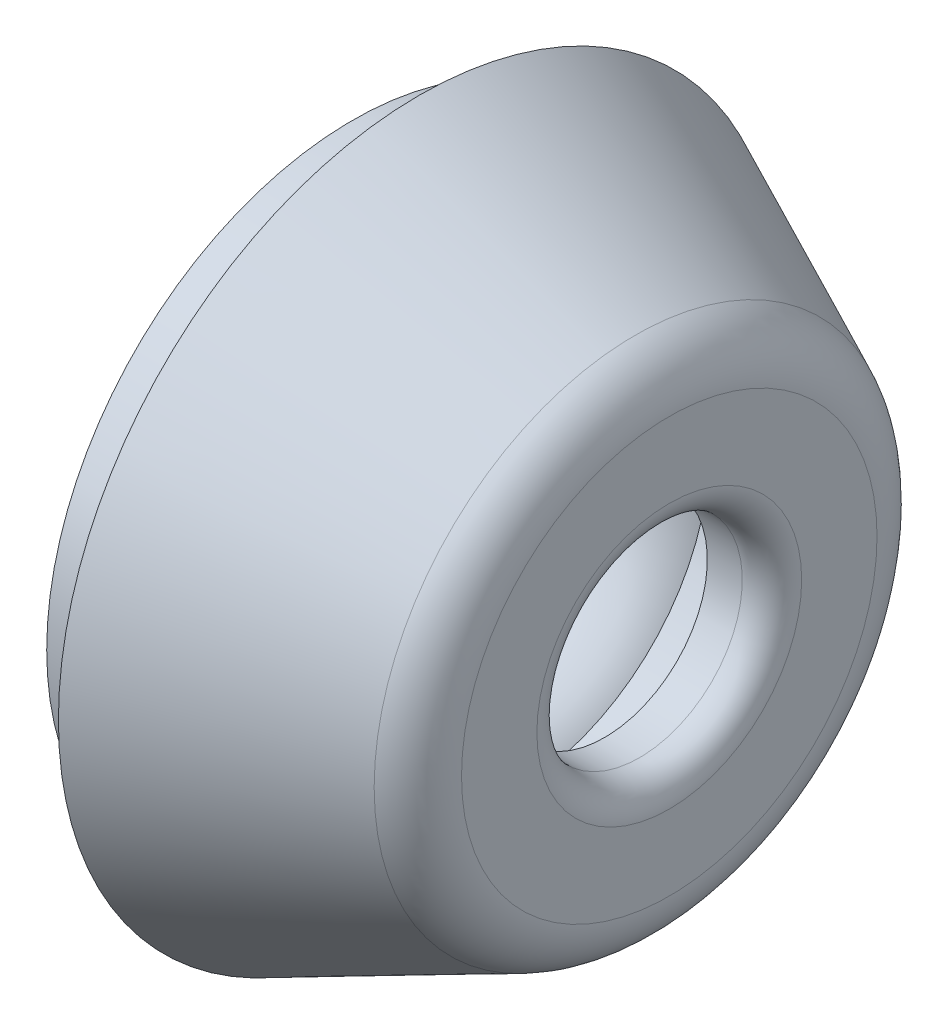
ISO-10303-21;
HEADER;
FILE_DESCRIPTION(('STEP AP214'),'2;1');
FILE_NAME('part.step','',(''),(''),'','','');
FILE_SCHEMA(('AUTOMOTIVE_DESIGN { 1 0 10303 214 1 1 1 1 }'));
ENDSEC;
DATA;
#1=APPLICATION_CONTEXT('core data for automotive mechanical design processes');
#2=APPLICATION_PROTOCOL_DEFINITION('international standard','automotive_design',2000,#1);
#3=PRODUCT_CONTEXT('',#1,'mechanical');
#4=PRODUCT('Part','Part','',(#3));
#5=PRODUCT_RELATED_PRODUCT_CATEGORY('part','',(#4));
#6=PRODUCT_DEFINITION_FORMATION('','',#4);
#7=PRODUCT_DEFINITION_CONTEXT('part definition',#1,'design');
#8=PRODUCT_DEFINITION('design','',#6,#7);
#9=PRODUCT_DEFINITION_SHAPE('','',#8);
#10=(LENGTH_UNIT() NAMED_UNIT(*) SI_UNIT(.MILLI.,.METRE.));
#11=(NAMED_UNIT(*) PLANE_ANGLE_UNIT() SI_UNIT($,.RADIAN.));
#12=(NAMED_UNIT(*) SI_UNIT($,.STERADIAN.) SOLID_ANGLE_UNIT());
#13=UNCERTAINTY_MEASURE_WITH_UNIT(LENGTH_MEASURE(1.E-05),#10,'distance_accuracy_value','');
#14=(GEOMETRIC_REPRESENTATION_CONTEXT(3) GLOBAL_UNCERTAINTY_ASSIGNED_CONTEXT((#13)) GLOBAL_UNIT_ASSIGNED_CONTEXT((#10,
#11,#12)) REPRESENTATION_CONTEXT('',''));
#15=CARTESIAN_POINT('',(0.,0.,0.));
#16=DIRECTION('',(0.,0.,1.));
#17=DIRECTION('',(1.,0.,0.));
#18=AXIS2_PLACEMENT_3D('',#15,#16,#17);
#19=CARTESIAN_POINT('',(110.416617783747,0.,0.));
#20=DIRECTION('',(-1.,0.,0.));
#21=DIRECTION('',(0.,0.,1.));
#22=AXIS2_PLACEMENT_3D('',#19,#20,#21);
#23=TOROIDAL_SURFACE('',#22,9.39873635566447,0.5);
#24=CARTESIAN_POINT('',(110.916617783747,0.,0.));
#25=DIRECTION('',(-1.,0.,0.));
#26=DIRECTION('',(0.,0.,1.));
#27=AXIS2_PLACEMENT_3D('',#24,#25,#26);
#28=CIRCLE('',#27,9.39873635566447);
#29=CARTESIAN_POINT('',(110.916617783747,0.,9.39873635566447));
#30=VERTEX_POINT('',#29);
#31=EDGE_CURVE('E391',#30,#30,#28,.T.);
#32=ORIENTED_EDGE('',*,*,#31,.F.);
#33=EDGE_LOOP('',(#32));
#34=FACE_BOUND('',#33,.T.);
#35=CARTESIAN_POINT('',(110.416617783747,0.,0.));
#36=DIRECTION('',(-1.,0.,0.));
#37=DIRECTION('',(0.,0.,1.));
#38=AXIS2_PLACEMENT_3D('',#35,#36,#37);
#39=CIRCLE('',#38,9.89873635566447);
#40=CARTESIAN_POINT('',(110.416617783747,0.,9.89873635566447));
#41=VERTEX_POINT('',#40);
#42=EDGE_CURVE('E10',#41,#41,#39,.T.);
#43=ORIENTED_EDGE('',*,*,#42,.T.);
#44=EDGE_LOOP('',(#43));
#45=FACE_BOUND('',#44,.T.);
#46=ADVANCED_FACE('F348',(#34,#45),#23,.F.);
#47=CARTESIAN_POINT('',(81.0485521486281,0.,0.));
#48=DIRECTION('',(-1.,0.,0.));
#49=DIRECTION('',(0.,0.,1.));
#50=AXIS2_PLACEMENT_3D('',#47,#48,#49);
#51=CYLINDRICAL_SURFACE('',#50,9.89873635566448);
#52=ORIENTED_EDGE('',*,*,#42,.F.);
#53=EDGE_LOOP('',(#52));
#54=FACE_BOUND('',#53,.T.);
#55=CARTESIAN_POINT('',(106.297199140327,0.,0.));
#56=DIRECTION('',(-1.,0.,0.));
#57=DIRECTION('',(0.,0.,1.));
#58=AXIS2_PLACEMENT_3D('',#55,#56,#57);
#59=CIRCLE('',#58,9.89873635566448);
#60=CARTESIAN_POINT('',(106.297199140327,0.,9.89873635566448));
#61=VERTEX_POINT('',#60);
#62=EDGE_CURVE('E354',#61,#61,#59,.T.);
#63=ORIENTED_EDGE('',*,*,#62,.T.);
#64=EDGE_LOOP('',(#63));
#65=FACE_BOUND('',#64,.T.);
#66=ADVANCED_FACE('F398',(#54,#65),#51,.F.);
#67=CARTESIAN_POINT('',(103.006374140455,0.,0.));
#68=DIRECTION('',(-1.,0.,0.));
#69=DIRECTION('',(0.,0.,1.));
#70=AXIS2_PLACEMENT_3D('',#67,#68,#69);
#71=TOROIDAL_SURFACE('',#70,12.6174528793483,4.26860032281516);
#72=ORIENTED_EDGE('',*,*,#62,.F.);
#73=EDGE_LOOP('',(#72));
#74=FACE_BOUND('',#73,.T.);
#75=CARTESIAN_POINT('',(99.7155491405822,0.,0.));
#76=DIRECTION('',(-1.,0.,0.));
#77=DIRECTION('',(0.,0.,1.));
#78=AXIS2_PLACEMENT_3D('',#75,#76,#77);
#79=CIRCLE('',#78,9.89873635566448);
#80=CARTESIAN_POINT('',(99.7155491405822,0.,9.89873635566448));
#81=VERTEX_POINT('',#80);
#82=EDGE_CURVE('E358',#81,#81,#79,.T.);
#83=ORIENTED_EDGE('',*,*,#82,.T.);
#84=EDGE_LOOP('',(#83));
#85=FACE_BOUND('',#84,.T.);
#86=ADVANCED_FACE('F402',(#74,#85),#71,.T.);
#87=CARTESIAN_POINT('',(81.0485521486281,0.,0.));
#88=DIRECTION('',(-1.,0.,0.));
#89=DIRECTION('',(0.,0.,1.));
#90=AXIS2_PLACEMENT_3D('',#87,#88,#89);
#91=CYLINDRICAL_SURFACE('',#90,9.89873635566448);
#92=ORIENTED_EDGE('',*,*,#82,.F.);
#93=EDGE_LOOP('',(#92));
#94=FACE_BOUND('',#93,.T.);
#95=CARTESIAN_POINT('',(98.1826368987741,0.,0.));
#96=DIRECTION('',(-1.,0.,0.));
#97=DIRECTION('',(0.,0.,1.));
#98=AXIS2_PLACEMENT_3D('',#95,#96,#97);
#99=CIRCLE('',#98,9.89873635566448);
#100=CARTESIAN_POINT('',(98.1826368987741,0.,9.89873635566448));
#101=VERTEX_POINT('',#100);
#102=EDGE_CURVE('E362',#101,#101,#99,.T.);
#103=ORIENTED_EDGE('',*,*,#102,.T.);
#104=EDGE_LOOP('',(#103));
#105=FACE_BOUND('',#104,.T.);
#106=ADVANCED_FACE('F407',(#94,#105),#91,.F.);
#107=CARTESIAN_POINT('',(98.1826368987741,9.89873635566448,0.));
#108=DIRECTION('',(1.,0.,0.));
#109=DIRECTION('',(0.,0.,-1.));
#110=AXIS2_PLACEMENT_3D('',#107,#108,#109);
#111=PLANE('',#110);
#112=ORIENTED_EDGE('',*,*,#102,.F.);
#113=EDGE_LOOP('',(#112));
#114=FACE_BOUND('',#113,.T.);
#115=CARTESIAN_POINT('',(98.1826368987741,0.,0.));
#116=DIRECTION('',(-1.,0.,0.));
#117=DIRECTION('',(0.,0.,1.));
#118=AXIS2_PLACEMENT_3D('',#115,#116,#117);
#119=CIRCLE('',#118,15.4533844189017);
#120=CARTESIAN_POINT('',(98.1826368987741,0.,15.4533844189017));
#121=VERTEX_POINT('',#120);
#122=EDGE_CURVE('E367',#121,#121,#119,.T.);
#123=ORIENTED_EDGE('',*,*,#122,.T.);
#124=EDGE_LOOP('',(#123));
#125=FACE_BOUND('',#124,.T.);
#126=ADVANCED_FACE('F413',(#114,#125),#111,.F.);
#127=CARTESIAN_POINT('',(81.0485521486281,0.,0.));
#128=DIRECTION('',(-1.,0.,0.));
#129=DIRECTION('',(0.,0.,1.));
#130=AXIS2_PLACEMENT_3D('',#127,#128,#129);
#131=CYLINDRICAL_SURFACE('',#130,15.4533844189017);
#132=ORIENTED_EDGE('',*,*,#122,.F.);
#133=EDGE_LOOP('',(#132));
#134=FACE_BOUND('',#133,.T.);
#135=CARTESIAN_POINT('',(101.558174273893,0.,0.));
#136=DIRECTION('',(-1.,0.,0.));
#137=DIRECTION('',(0.,0.,1.));
#138=AXIS2_PLACEMENT_3D('',#135,#136,#137);
#139=CIRCLE('',#138,15.4533844189017);
#140=CARTESIAN_POINT('',(101.558174273893,0.,15.4533844189017));
#141=VERTEX_POINT('',#140);
#142=EDGE_CURVE('E370',#141,#141,#139,.T.);
#143=ORIENTED_EDGE('',*,*,#142,.T.);
#144=EDGE_LOOP('',(#143));
#145=FACE_BOUND('',#144,.T.);
#146=ADVANCED_FACE('F417',(#134,#145),#131,.T.);
#147=CARTESIAN_POINT('',(101.558174273893,15.4533844189017,0.));
#148=DIRECTION('',(1.,0.,0.));
#149=DIRECTION('',(0.,0.,-1.));
#150=AXIS2_PLACEMENT_3D('',#147,#148,#149);
#151=PLANE('',#150);
#152=ORIENTED_EDGE('',*,*,#142,.F.);
#153=EDGE_LOOP('',(#152));
#154=FACE_BOUND('',#153,.T.);
#155=CARTESIAN_POINT('',(101.558174273893,0.,0.));
#156=DIRECTION('',(-1.,0.,0.));
#157=DIRECTION('',(0.,0.,1.));
#158=AXIS2_PLACEMENT_3D('',#155,#156,#157);
#159=CIRCLE('',#158,18.2381894540579);
#160=CARTESIAN_POINT('',(101.558174273893,0.,18.2381894540579));
#161=VERTEX_POINT('',#160);
#162=EDGE_CURVE('E373',#161,#161,#159,.T.);
#163=ORIENTED_EDGE('',*,*,#162,.T.);
#164=EDGE_LOOP('',(#163));
#165=FACE_BOUND('',#164,.T.);
#166=ADVANCED_FACE('F421',(#154,#165),#151,.F.);
#167=CARTESIAN_POINT('',(112.461882094488,0.,0.));
#168=DIRECTION('',(-1.,0.,0.));
#169=DIRECTION('',(0.,0.,1.));
#170=AXIS2_PLACEMENT_3D('',#167,#168,#169);
#171=CONICAL_SURFACE('',#170,13.189244145594,0.433651902780074);
#172=ORIENTED_EDGE('',*,*,#162,.F.);
#173=EDGE_LOOP('',(#172));
#174=FACE_BOUND('',#173,.T.);
#175=CARTESIAN_POINT('',(112.461882094488,0.,0.));
#176=DIRECTION('',(-1.,0.,0.));
#177=DIRECTION('',(0.,0.,1.));
#178=AXIS2_PLACEMENT_3D('',#175,#176,#177);
#179=CIRCLE('',#178,13.189244145594);
#180=CARTESIAN_POINT('',(112.461882094488,0.,13.189244145594));
#181=VERTEX_POINT('',#180);
#182=EDGE_CURVE('E376',#181,#181,#179,.T.);
#183=ORIENTED_EDGE('',*,*,#182,.T.);
#184=EDGE_LOOP('',(#183));
#185=FACE_BOUND('',#184,.T.);
#186=ADVANCED_FACE('F425',(#174,#185),#171,.T.);
#187=CARTESIAN_POINT('',(111.214859014138,0.,0.));
#188=DIRECTION('',(-1.,0.,0.));
#189=DIRECTION('',(0.,0.,1.));
#190=AXIS2_PLACEMENT_3D('',#187,#188,#189);
#191=TOROIDAL_SURFACE('',#190,10.4961717348319,2.96777788463559);
#192=ORIENTED_EDGE('',*,*,#182,.F.);
#193=EDGE_LOOP('',(#192));
#194=FACE_BOUND('',#193,.T.);
#195=CARTESIAN_POINT('',(114.182636898774,0.,0.));
#196=DIRECTION('',(-1.,0.,0.));
#197=DIRECTION('',(0.,0.,1.));
#198=AXIS2_PLACEMENT_3D('',#195,#196,#197);
#199=CIRCLE('',#198,10.4961717348319);
#200=CARTESIAN_POINT('',(114.182636898774,0.,10.4961717348319));
#201=VERTEX_POINT('',#200);
#202=EDGE_CURVE('E379',#201,#201,#199,.T.);
#203=ORIENTED_EDGE('',*,*,#202,.T.);
#204=EDGE_LOOP('',(#203));
#205=FACE_BOUND('',#204,.T.);
#206=ADVANCED_FACE('F429',(#194,#205),#191,.T.);
#207=CARTESIAN_POINT('',(114.182636898774,10.4961717348319,0.));
#208=DIRECTION('',(-1.,0.,0.));
#209=DIRECTION('',(0.,0.,1.));
#210=AXIS2_PLACEMENT_3D('',#207,#208,#209);
#211=PLANE('',#210);
#212=ORIENTED_EDGE('',*,*,#202,.F.);
#213=EDGE_LOOP('',(#212));
#214=FACE_BOUND('',#213,.T.);
#215=CARTESIAN_POINT('',(114.182636898774,0.,0.));
#216=DIRECTION('',(-1.,0.,0.));
#217=DIRECTION('',(0.,0.,1.));
#218=AXIS2_PLACEMENT_3D('',#215,#216,#217);
#219=CIRCLE('',#218,6.6895165039071);
#220=CARTESIAN_POINT('',(114.182636898774,0.,6.6895165039071));
#221=VERTEX_POINT('',#220);
#222=EDGE_CURVE('E382',#221,#221,#219,.T.);
#223=ORIENTED_EDGE('',*,*,#222,.T.);
#224=EDGE_LOOP('',(#223));
#225=FACE_BOUND('',#224,.T.);
#226=ADVANCED_FACE('F433',(#214,#225),#211,.F.);
#227=CARTESIAN_POINT('',(112.682636898774,0.,0.));
#228=DIRECTION('',(-1.,0.,0.));
#229=DIRECTION('',(0.,0.,1.));
#230=AXIS2_PLACEMENT_3D('',#227,#228,#229);
#231=TOROIDAL_SURFACE('',#230,6.6895165039071,1.5);
#232=ORIENTED_EDGE('',*,*,#222,.F.);
#233=EDGE_LOOP('',(#232));
#234=FACE_BOUND('',#233,.T.);
#235=CARTESIAN_POINT('',(112.682636898774,0.,0.));
#236=DIRECTION('',(-1.,0.,0.));
#237=DIRECTION('',(0.,0.,1.));
#238=AXIS2_PLACEMENT_3D('',#235,#236,#237);
#239=CIRCLE('',#238,5.1895165039071);
#240=CARTESIAN_POINT('',(112.682636898774,0.,5.1895165039071));
#241=VERTEX_POINT('',#240);
#242=EDGE_CURVE('E385',#241,#241,#239,.T.);
#243=ORIENTED_EDGE('',*,*,#242,.T.);
#244=EDGE_LOOP('',(#243));
#245=FACE_BOUND('',#244,.T.);
#246=ADVANCED_FACE('F437',(#234,#245),#231,.T.);
#247=CARTESIAN_POINT('',(81.0485521486281,0.,0.));
#248=DIRECTION('',(-1.,0.,0.));
#249=DIRECTION('',(0.,0.,1.));
#250=AXIS2_PLACEMENT_3D('',#247,#248,#249);
#251=CYLINDRICAL_SURFACE('',#250,5.18951650390711);
#252=ORIENTED_EDGE('',*,*,#242,.F.);
#253=EDGE_LOOP('',(#252));
#254=FACE_BOUND('',#253,.T.);
#255=CARTESIAN_POINT('',(110.916617783747,0.,0.));
#256=DIRECTION('',(-1.,0.,0.));
#257=DIRECTION('',(0.,0.,1.));
#258=AXIS2_PLACEMENT_3D('',#255,#256,#257);
#259=CIRCLE('',#258,5.18951650390711);
#260=CARTESIAN_POINT('',(110.916617783747,0.,5.18951650390711));
#261=VERTEX_POINT('',#260);
#262=EDGE_CURVE('E388',#261,#261,#259,.T.);
#263=ORIENTED_EDGE('',*,*,#262,.T.);
#264=EDGE_LOOP('',(#263));
#265=FACE_BOUND('',#264,.T.);
#266=ADVANCED_FACE('F441',(#254,#265),#251,.F.);
#267=CARTESIAN_POINT('',(110.916617783747,9.39873635566447,0.));
#268=DIRECTION('',(1.,0.,0.));
#269=DIRECTION('',(0.,0.,-1.));
#270=AXIS2_PLACEMENT_3D('',#267,#268,#269);
#271=PLANE('',#270);
#272=ORIENTED_EDGE('',*,*,#262,.F.);
#273=EDGE_LOOP('',(#272));
#274=FACE_BOUND('',#273,.T.);
#275=ORIENTED_EDGE('',*,*,#31,.T.);
#276=EDGE_LOOP('',(#275));
#277=FACE_BOUND('',#276,.T.);
#278=ADVANCED_FACE('F395',(#274,#277),#271,.F.);
#279=CLOSED_SHELL('',(#46,#66,#86,#106,#126,#146,#166,#186,#206,#226,#246,#266,#278));
#280=MANIFOLD_SOLID_BREP('B2',#279);
#281=ADVANCED_BREP_SHAPE_REPRESENTATION('',(#18,#280),#14);
#282=SHAPE_DEFINITION_REPRESENTATION(#9,#281);
ENDSEC;
END-ISO-10303-21;
